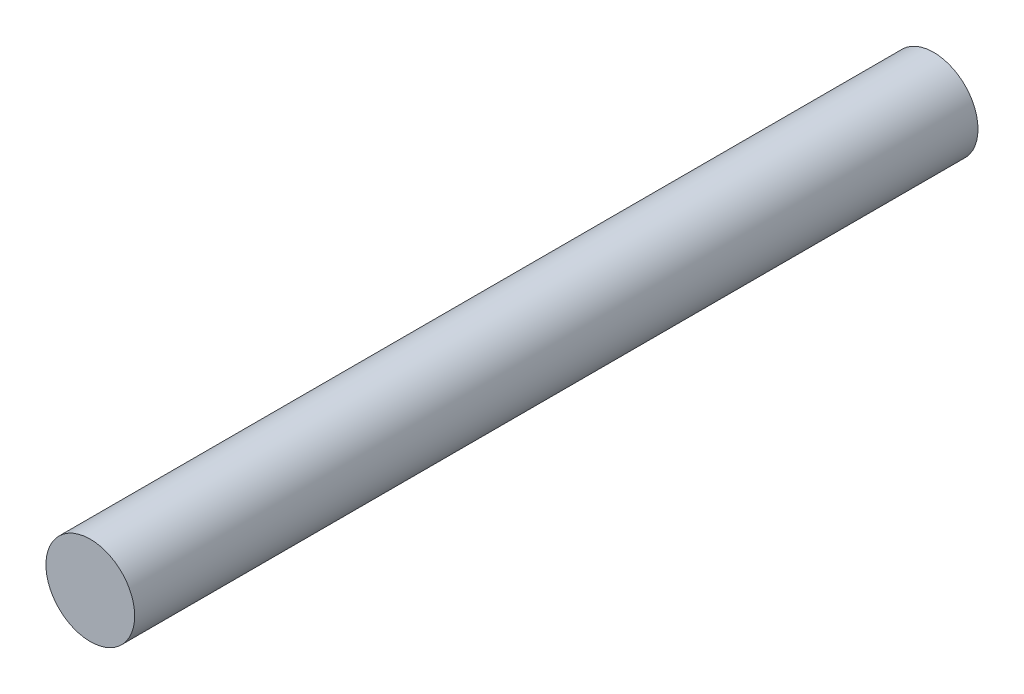
ISO-10303-21;
HEADER;
FILE_DESCRIPTION(('STEP AP214'),'2;1');
FILE_NAME('part.step','',(''),(''),'','','');
FILE_SCHEMA(('AUTOMOTIVE_DESIGN { 1 0 10303 214 1 1 1 1 }'));
ENDSEC;
DATA;
#1=APPLICATION_CONTEXT('core data for automotive mechanical design processes');
#2=APPLICATION_PROTOCOL_DEFINITION('international standard','automotive_design',2000,#1);
#3=PRODUCT_CONTEXT('',#1,'mechanical');
#4=PRODUCT('Part','Part','',(#3));
#5=PRODUCT_RELATED_PRODUCT_CATEGORY('part','',(#4));
#6=PRODUCT_DEFINITION_FORMATION('','',#4);
#7=PRODUCT_DEFINITION_CONTEXT('part definition',#1,'design');
#8=PRODUCT_DEFINITION('design','',#6,#7);
#9=PRODUCT_DEFINITION_SHAPE('','',#8);
#10=(LENGTH_UNIT() NAMED_UNIT(*) SI_UNIT(.MILLI.,.METRE.));
#11=(NAMED_UNIT(*) PLANE_ANGLE_UNIT() SI_UNIT($,.RADIAN.));
#12=(NAMED_UNIT(*) SI_UNIT($,.STERADIAN.) SOLID_ANGLE_UNIT());
#13=UNCERTAINTY_MEASURE_WITH_UNIT(LENGTH_MEASURE(1.E-05),#10,'distance_accuracy_value','');
#14=(GEOMETRIC_REPRESENTATION_CONTEXT(3) GLOBAL_UNCERTAINTY_ASSIGNED_CONTEXT((#13)) GLOBAL_UNIT_ASSIGNED_CONTEXT((#10,
#11,#12)) REPRESENTATION_CONTEXT('',''));
#15=CARTESIAN_POINT('',(0.,0.,0.));
#16=DIRECTION('',(0.,0.,1.));
#17=DIRECTION('',(1.,0.,0.));
#18=AXIS2_PLACEMENT_3D('',#15,#16,#17);
#19=CARTESIAN_POINT('',(0.,0.,38.));
#20=DIRECTION('',(0.,0.,-1.));
#21=DIRECTION('',(-1.,0.,0.));
#22=AXIS2_PLACEMENT_3D('',#19,#20,#21);
#23=CYLINDRICAL_SURFACE('',#22,2.);
#24=CARTESIAN_POINT('',(0.,0.,38.));
#25=DIRECTION('',(0.,0.,1.));
#26=DIRECTION('',(1.,0.,0.));
#27=AXIS2_PLACEMENT_3D('',#24,#25,#26);
#28=CIRCLE('',#27,2.);
#29=CARTESIAN_POINT('',(2.,0.,38.));
#30=VERTEX_POINT('',#29);
#31=EDGE_CURVE('E10',#30,#30,#28,.T.);
#32=ORIENTED_EDGE('',*,*,#31,.F.);
#33=EDGE_LOOP('',(#32));
#34=FACE_BOUND('',#33,.T.);
#35=CARTESIAN_POINT('',(0.,0.,0.));
#36=DIRECTION('',(0.,0.,1.));
#37=DIRECTION('',(1.,0.,0.));
#38=AXIS2_PLACEMENT_3D('',#35,#36,#37);
#39=CIRCLE('',#38,2.);
#40=CARTESIAN_POINT('',(2.,0.,0.));
#41=VERTEX_POINT('',#40);
#42=EDGE_CURVE('E42',#41,#41,#39,.T.);
#43=ORIENTED_EDGE('',*,*,#42,.T.);
#44=EDGE_LOOP('',(#43));
#45=FACE_BOUND('',#44,.T.);
#46=ADVANCED_FACE('F39',(#34,#45),#23,.T.);
#47=CARTESIAN_POINT('',(0.,0.,38.));
#48=DIRECTION('',(0.,0.,1.));
#49=DIRECTION('',(1.,0.,0.));
#50=AXIS2_PLACEMENT_3D('',#47,#48,#49);
#51=PLANE('',#50);
#52=ORIENTED_EDGE('',*,*,#31,.T.);
#53=EDGE_LOOP('',(#52));
#54=FACE_BOUND('',#53,.T.);
#55=ADVANCED_FACE('F54',(#54),#51,.T.);
#56=CARTESIAN_POINT('',(0.,0.,0.));
#57=DIRECTION('',(0.,0.,1.));
#58=DIRECTION('',(1.,0.,0.));
#59=AXIS2_PLACEMENT_3D('',#56,#57,#58);
#60=PLANE('',#59);
#61=ORIENTED_EDGE('',*,*,#42,.F.);
#62=EDGE_LOOP('',(#61));
#63=FACE_BOUND('',#62,.T.);
#64=ADVANCED_FACE('F52',(#63),#60,.F.);
#65=CLOSED_SHELL('',(#46,#55,#64));
#66=MANIFOLD_SOLID_BREP('B2',#65);
#67=ADVANCED_BREP_SHAPE_REPRESENTATION('',(#18,#66),#14);
#68=SHAPE_DEFINITION_REPRESENTATION(#9,#67);
ENDSEC;
END-ISO-10303-21;
